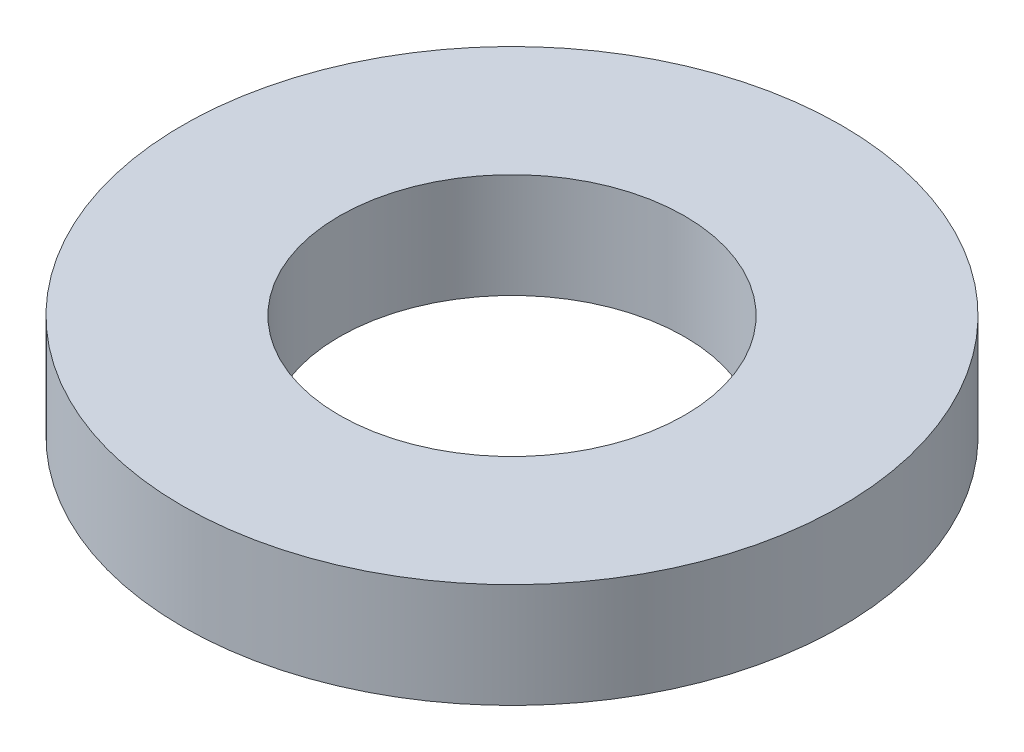
ISO-10303-21;
HEADER;
FILE_DESCRIPTION(('STEP AP214'),'2;1');
FILE_NAME('part.step','',(''),(''),'','','');
FILE_SCHEMA(('AUTOMOTIVE_DESIGN { 1 0 10303 214 1 1 1 1 }'));
ENDSEC;
DATA;
#1=APPLICATION_CONTEXT('core data for automotive mechanical design processes');
#2=APPLICATION_PROTOCOL_DEFINITION('international standard','automotive_design',2000,#1);
#3=PRODUCT_CONTEXT('',#1,'mechanical');
#4=PRODUCT('Part','Part','',(#3));
#5=PRODUCT_RELATED_PRODUCT_CATEGORY('part','',(#4));
#6=PRODUCT_DEFINITION_FORMATION('','',#4);
#7=PRODUCT_DEFINITION_CONTEXT('part definition',#1,'design');
#8=PRODUCT_DEFINITION('design','',#6,#7);
#9=PRODUCT_DEFINITION_SHAPE('','',#8);
#10=(LENGTH_UNIT() NAMED_UNIT(*) SI_UNIT(.MILLI.,.METRE.));
#11=(NAMED_UNIT(*) PLANE_ANGLE_UNIT() SI_UNIT($,.RADIAN.));
#12=(NAMED_UNIT(*) SI_UNIT($,.STERADIAN.) SOLID_ANGLE_UNIT());
#13=UNCERTAINTY_MEASURE_WITH_UNIT(LENGTH_MEASURE(1.E-05),#10,'distance_accuracy_value','');
#14=(GEOMETRIC_REPRESENTATION_CONTEXT(3) GLOBAL_UNCERTAINTY_ASSIGNED_CONTEXT((#13)) GLOBAL_UNIT_ASSIGNED_CONTEXT((#10,
#11,#12)) REPRESENTATION_CONTEXT('',''));
#15=CARTESIAN_POINT('',(0.,0.,0.));
#16=DIRECTION('',(0.,0.,1.));
#17=DIRECTION('',(1.,0.,0.));
#18=AXIS2_PLACEMENT_3D('',#15,#16,#17);
#19=CARTESIAN_POINT('',(0.,10.,0.));
#20=DIRECTION('',(0.,1.,0.));
#21=DIRECTION('',(0.,0.,1.));
#22=AXIS2_PLACEMENT_3D('',#19,#20,#21);
#23=PLANE('',#22);
#24=CARTESIAN_POINT('',(0.,10.,0.));
#25=DIRECTION('',(0.,1.,0.));
#26=DIRECTION('',(0.,0.,1.));
#27=AXIS2_PLACEMENT_3D('',#24,#25,#26);
#28=CIRCLE('',#27,31.5);
#29=CARTESIAN_POINT('',(0.,10.,31.5));
#30=VERTEX_POINT('',#29);
#31=EDGE_CURVE('E10',#30,#30,#28,.T.);
#32=ORIENTED_EDGE('',*,*,#31,.T.);
#33=EDGE_LOOP('',(#32));
#34=FACE_BOUND('',#33,.T.);
#35=CARTESIAN_POINT('',(0.,10.,0.));
#36=DIRECTION('',(0.,1.,0.));
#37=DIRECTION('',(0.,0.,1.));
#38=AXIS2_PLACEMENT_3D('',#35,#36,#37);
#39=CIRCLE('',#38,16.5);
#40=CARTESIAN_POINT('',(0.,10.,16.5));
#41=VERTEX_POINT('',#40);
#42=EDGE_CURVE('E56',#41,#41,#39,.T.);
#43=ORIENTED_EDGE('',*,*,#42,.F.);
#44=EDGE_LOOP('',(#43));
#45=FACE_BOUND('',#44,.T.);
#46=ADVANCED_FACE('F43',(#34,#45),#23,.T.);
#47=CARTESIAN_POINT('',(0.,0.,0.));
#48=DIRECTION('',(0.,1.,0.));
#49=DIRECTION('',(0.,0.,1.));
#50=AXIS2_PLACEMENT_3D('',#47,#48,#49);
#51=PLANE('',#50);
#52=CARTESIAN_POINT('',(0.,0.,0.));
#53=DIRECTION('',(0.,1.,0.));
#54=DIRECTION('',(0.,0.,1.));
#55=AXIS2_PLACEMENT_3D('',#52,#53,#54);
#56=CIRCLE('',#55,31.5);
#57=CARTESIAN_POINT('',(0.,0.,31.5));
#58=VERTEX_POINT('',#57);
#59=EDGE_CURVE('E47',#58,#58,#56,.T.);
#60=ORIENTED_EDGE('',*,*,#59,.F.);
#61=EDGE_LOOP('',(#60));
#62=FACE_BOUND('',#61,.T.);
#63=CARTESIAN_POINT('',(0.,0.,0.));
#64=DIRECTION('',(0.,1.,0.));
#65=DIRECTION('',(0.,0.,1.));
#66=AXIS2_PLACEMENT_3D('',#63,#64,#65);
#67=CIRCLE('',#66,16.5);
#68=CARTESIAN_POINT('',(0.,0.,16.5));
#69=VERTEX_POINT('',#68);
#70=EDGE_CURVE('E58',#69,#69,#67,.T.);
#71=ORIENTED_EDGE('',*,*,#70,.T.);
#72=EDGE_LOOP('',(#71));
#73=FACE_BOUND('',#72,.T.);
#74=ADVANCED_FACE('F70',(#62,#73),#51,.F.);
#75=CARTESIAN_POINT('',(0.,10.,0.));
#76=DIRECTION('',(0.,-1.,0.));
#77=DIRECTION('',(0.,0.,-1.));
#78=AXIS2_PLACEMENT_3D('',#75,#76,#77);
#79=CYLINDRICAL_SURFACE('',#78,31.5);
#80=ORIENTED_EDGE('',*,*,#31,.F.);
#81=EDGE_LOOP('',(#80));
#82=FACE_BOUND('',#81,.T.);
#83=ORIENTED_EDGE('',*,*,#59,.T.);
#84=EDGE_LOOP('',(#83));
#85=FACE_BOUND('',#84,.T.);
#86=ADVANCED_FACE('F45',(#82,#85),#79,.T.);
#87=CARTESIAN_POINT('',(0.,10.,0.));
#88=DIRECTION('',(0.,-1.,0.));
#89=DIRECTION('',(0.,0.,-1.));
#90=AXIS2_PLACEMENT_3D('',#87,#88,#89);
#91=CYLINDRICAL_SURFACE('',#90,16.5);
#92=ORIENTED_EDGE('',*,*,#42,.T.);
#93=EDGE_LOOP('',(#92));
#94=FACE_BOUND('',#93,.T.);
#95=ORIENTED_EDGE('',*,*,#70,.F.);
#96=EDGE_LOOP('',(#95));
#97=FACE_BOUND('',#96,.T.);
#98=ADVANCED_FACE('F66',(#94,#97),#91,.F.);
#99=CLOSED_SHELL('',(#46,#74,#86,#98));
#100=MANIFOLD_SOLID_BREP('B2',#99);
#101=ADVANCED_BREP_SHAPE_REPRESENTATION('',(#18,#100),#14);
#102=SHAPE_DEFINITION_REPRESENTATION(#9,#101);
ENDSEC;
END-ISO-10303-21;
